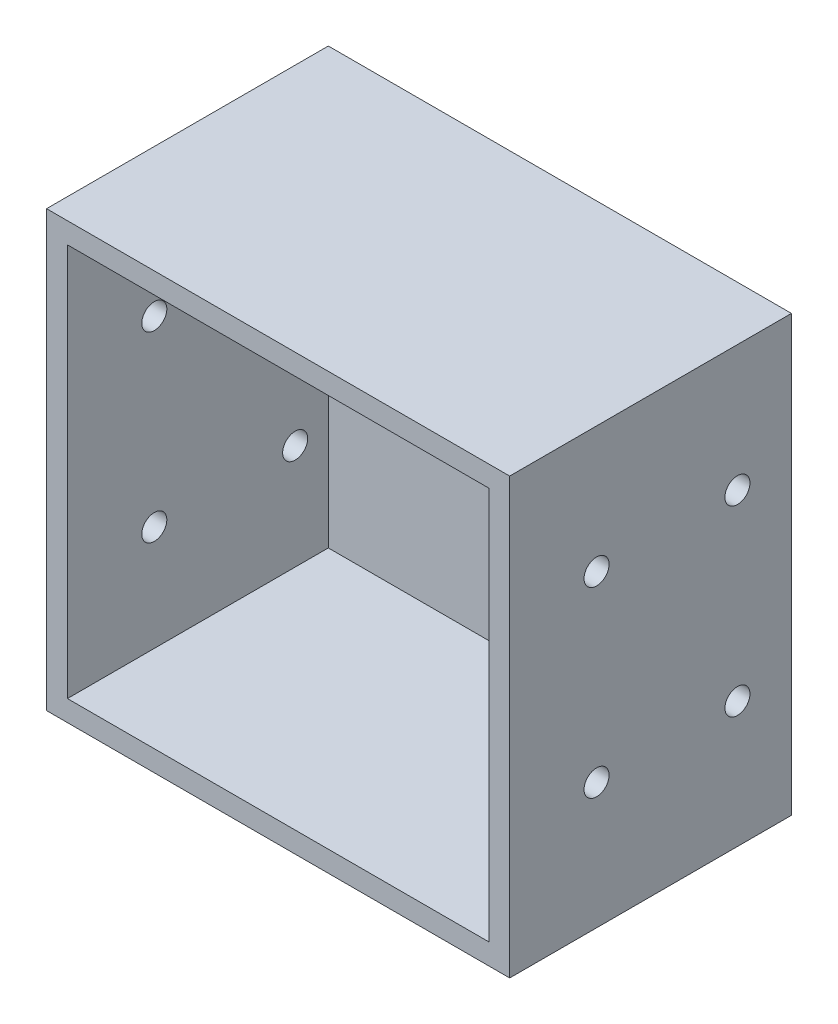
ISO-10303-21;
HEADER;
FILE_DESCRIPTION(('STEP AP214'),'2;1');
FILE_NAME('part.step','',(''),(''),'','','');
FILE_SCHEMA(('AUTOMOTIVE_DESIGN { 1 0 10303 214 1 1 1 1 }'));
ENDSEC;
DATA;
#1=APPLICATION_CONTEXT('core data for automotive mechanical design processes');
#2=APPLICATION_PROTOCOL_DEFINITION('international standard','automotive_design',2000,#1);
#3=PRODUCT_CONTEXT('',#1,'mechanical');
#4=PRODUCT('Part','Part','',(#3));
#5=PRODUCT_RELATED_PRODUCT_CATEGORY('part','',(#4));
#6=PRODUCT_DEFINITION_FORMATION('','',#4);
#7=PRODUCT_DEFINITION_CONTEXT('part definition',#1,'design');
#8=PRODUCT_DEFINITION('design','',#6,#7);
#9=PRODUCT_DEFINITION_SHAPE('','',#8);
#10=(LENGTH_UNIT() NAMED_UNIT(*) SI_UNIT(.MILLI.,.METRE.));
#11=(NAMED_UNIT(*) PLANE_ANGLE_UNIT() SI_UNIT($,.RADIAN.));
#12=(NAMED_UNIT(*) SI_UNIT($,.STERADIAN.) SOLID_ANGLE_UNIT());
#13=UNCERTAINTY_MEASURE_WITH_UNIT(LENGTH_MEASURE(1.E-05),#10,'distance_accuracy_value','');
#14=(GEOMETRIC_REPRESENTATION_CONTEXT(3) GLOBAL_UNCERTAINTY_ASSIGNED_CONTEXT((#13)) GLOBAL_UNIT_ASSIGNED_CONTEXT((#10,
#11,#12)) REPRESENTATION_CONTEXT('',''));
#15=CARTESIAN_POINT('',(0.,0.,0.));
#16=DIRECTION('',(0.,0.,1.));
#17=DIRECTION('',(1.,0.,0.));
#18=AXIS2_PLACEMENT_3D('',#15,#16,#17);
#19=CARTESIAN_POINT('',(44.381,37.656,50.));
#20=DIRECTION('',(-1.,0.,0.));
#21=DIRECTION('',(0.,-1.,0.));
#22=AXIS2_PLACEMENT_3D('',#19,#20,#21);
#23=PLANE('',#22);
#24=CARTESIAN_POINT('',(44.381,-17.5,33.35));
#25=DIRECTION('',(1.,0.,0.));
#26=DIRECTION('',(0.,0.,-1.));
#27=AXIS2_PLACEMENT_3D('',#24,#25,#26);
#28=CIRCLE('',#27,2.39999999999999);
#29=CARTESIAN_POINT('',(44.381,-17.5,30.95));
#30=VERTEX_POINT('',#29);
#31=EDGE_CURVE('E309',#30,#30,#28,.T.);
#32=ORIENTED_EDGE('',*,*,#31,.F.);
#33=EDGE_LOOP('',(#32));
#34=FACE_BOUND('',#33,.T.);
#35=CARTESIAN_POINT('',(44.381,-17.5000000000005,6.35000000000013));
#36=DIRECTION('',(1.,0.,0.));
#37=DIRECTION('',(0.,0.,-1.));
#38=AXIS2_PLACEMENT_3D('',#35,#36,#37);
#39=CIRCLE('',#38,2.39999999999999);
#40=CARTESIAN_POINT('',(44.381,-17.5000000000005,3.95000000000014));
#41=VERTEX_POINT('',#40);
#42=EDGE_CURVE('E300',#41,#41,#39,.T.);
#43=ORIENTED_EDGE('',*,*,#42,.F.);
#44=EDGE_LOOP('',(#43));
#45=FACE_BOUND('',#44,.T.);
#46=CARTESIAN_POINT('',(44.381,17.4999999999995,6.34999999999989));
#47=DIRECTION('',(1.,0.,0.));
#48=DIRECTION('',(0.,0.,-1.));
#49=AXIS2_PLACEMENT_3D('',#46,#47,#48);
#50=CIRCLE('',#49,2.39999999999999);
#51=CARTESIAN_POINT('',(44.381,17.4999999999995,3.9499999999999));
#52=VERTEX_POINT('',#51);
#53=EDGE_CURVE('E177',#52,#52,#50,.T.);
#54=ORIENTED_EDGE('',*,*,#53,.F.);
#55=EDGE_LOOP('',(#54));
#56=FACE_BOUND('',#55,.T.);
#57=DIRECTION('',(0.,1.,0.));
#58=VECTOR('',#57,1.);
#59=CARTESIAN_POINT('',(44.381,37.656,-4.));
#60=LINE('',#59,#58);
#61=CARTESIAN_POINT('',(44.381,-41.656,-4.));
#62=VERTEX_POINT('',#61);
#63=CARTESIAN_POINT('',(44.381,41.656,-4.));
#64=VERTEX_POINT('',#63);
#65=EDGE_CURVE('E156',#62,#64,#60,.T.);
#66=ORIENTED_EDGE('',*,*,#65,.T.);
#67=DIRECTION('',(0.,0.,-1.));
#68=VECTOR('',#67,1.);
#69=CARTESIAN_POINT('',(44.381,41.656,50.));
#70=LINE('',#69,#68);
#71=CARTESIAN_POINT('',(44.381,41.656,50.));
#72=VERTEX_POINT('',#71);
#73=EDGE_CURVE('E154',#72,#64,#70,.T.);
#74=ORIENTED_EDGE('',*,*,#73,.F.);
#75=DIRECTION('',(0.,1.,0.));
#76=VECTOR('',#75,1.);
#77=CARTESIAN_POINT('',(44.381,37.656,50.));
#78=LINE('',#77,#76);
#79=CARTESIAN_POINT('',(44.381,-41.656,50.));
#80=VERTEX_POINT('',#79);
#81=EDGE_CURVE('E168',#80,#72,#78,.T.);
#82=ORIENTED_EDGE('',*,*,#81,.F.);
#83=DIRECTION('',(0.,0.,-1.));
#84=VECTOR('',#83,1.);
#85=CARTESIAN_POINT('',(44.381,-41.656,50.));
#86=LINE('',#85,#84);
#87=EDGE_CURVE('E46',#80,#62,#86,.T.);
#88=ORIENTED_EDGE('',*,*,#87,.T.);
#89=EDGE_LOOP('',(#66,#74,#82,#88));
#90=FACE_BOUND('',#89,.T.);
#91=CARTESIAN_POINT('',(44.381,17.5,33.3499999999995));
#92=DIRECTION('',(1.,0.,0.));
#93=DIRECTION('',(0.,0.,-1.));
#94=AXIS2_PLACEMENT_3D('',#91,#92,#93);
#95=CIRCLE('',#94,2.39999999999999);
#96=CARTESIAN_POINT('',(44.381,17.5,30.9499999999995));
#97=VERTEX_POINT('',#96);
#98=EDGE_CURVE('E180',#97,#97,#95,.T.);
#99=ORIENTED_EDGE('',*,*,#98,.F.);
#100=EDGE_LOOP('',(#99));
#101=FACE_BOUND('',#100,.T.);
#102=ADVANCED_FACE('F37',(#34,#45,#56,#90,#101),#23,.F.);
#103=CARTESIAN_POINT('',(-44.381,37.656,50.));
#104=DIRECTION('',(1.,0.,0.));
#105=DIRECTION('',(0.,1.,0.));
#106=AXIS2_PLACEMENT_3D('',#103,#104,#105);
#107=PLANE('',#106);
#108=CARTESIAN_POINT('',(-44.381,-17.5,33.35));
#109=DIRECTION('',(1.,0.,0.));
#110=DIRECTION('',(0.,0.,-1.));
#111=AXIS2_PLACEMENT_3D('',#108,#109,#110);
#112=CIRCLE('',#111,2.39999999999998);
#113=CARTESIAN_POINT('',(-44.381,-17.5,30.95));
#114=VERTEX_POINT('',#113);
#115=EDGE_CURVE('E306',#114,#114,#112,.T.);
#116=ORIENTED_EDGE('',*,*,#115,.T.);
#117=EDGE_LOOP('',(#116));
#118=FACE_BOUND('',#117,.T.);
#119=CARTESIAN_POINT('',(-44.381,-17.5000000000005,6.35000000000013));
#120=DIRECTION('',(1.,0.,0.));
#121=DIRECTION('',(0.,0.,-1.));
#122=AXIS2_PLACEMENT_3D('',#119,#120,#121);
#123=CIRCLE('',#122,2.39999999999998);
#124=CARTESIAN_POINT('',(-44.381,-17.5000000000005,3.95000000000015));
#125=VERTEX_POINT('',#124);
#126=EDGE_CURVE('E295',#125,#125,#123,.T.);
#127=ORIENTED_EDGE('',*,*,#126,.T.);
#128=EDGE_LOOP('',(#127));
#129=FACE_BOUND('',#128,.T.);
#130=CARTESIAN_POINT('',(-44.381,17.5,33.3499999999995));
#131=DIRECTION('',(1.,0.,0.));
#132=DIRECTION('',(0.,0.,-1.));
#133=AXIS2_PLACEMENT_3D('',#130,#131,#132);
#134=CIRCLE('',#133,2.39999999999998);
#135=CARTESIAN_POINT('',(-44.381,17.5,30.9499999999995));
#136=VERTEX_POINT('',#135);
#137=EDGE_CURVE('E173',#136,#136,#134,.T.);
#138=ORIENTED_EDGE('',*,*,#137,.T.);
#139=EDGE_LOOP('',(#138));
#140=FACE_BOUND('',#139,.T.);
#141=CARTESIAN_POINT('',(-44.381,17.4999999999995,6.34999999999989));
#142=DIRECTION('',(1.,0.,0.));
#143=DIRECTION('',(0.,0.,-1.));
#144=AXIS2_PLACEMENT_3D('',#141,#142,#143);
#145=CIRCLE('',#144,2.39999999999998);
#146=CARTESIAN_POINT('',(-44.381,17.4999999999995,3.94999999999991));
#147=VERTEX_POINT('',#146);
#148=EDGE_CURVE('E191',#147,#147,#145,.T.);
#149=ORIENTED_EDGE('',*,*,#148,.T.);
#150=EDGE_LOOP('',(#149));
#151=FACE_BOUND('',#150,.T.);
#152=DIRECTION('',(0.,-1.,0.));
#153=VECTOR('',#152,1.);
#154=CARTESIAN_POINT('',(-44.381,37.656,-4.));
#155=LINE('',#154,#153);
#156=CARTESIAN_POINT('',(-44.381,41.656,-4.));
#157=VERTEX_POINT('',#156);
#158=CARTESIAN_POINT('',(-44.381,-41.656,-4.));
#159=VERTEX_POINT('',#158);
#160=EDGE_CURVE('E126',#157,#159,#155,.T.);
#161=ORIENTED_EDGE('',*,*,#160,.T.);
#162=DIRECTION('',(0.,0.,-1.));
#163=VECTOR('',#162,1.);
#164=CARTESIAN_POINT('',(-44.381,-41.656,50.));
#165=LINE('',#164,#163);
#166=CARTESIAN_POINT('',(-44.381,-41.656,50.));
#167=VERTEX_POINT('',#166);
#168=EDGE_CURVE('E11',#167,#159,#165,.T.);
#169=ORIENTED_EDGE('',*,*,#168,.F.);
#170=DIRECTION('',(0.,-1.,0.));
#171=VECTOR('',#170,1.);
#172=CARTESIAN_POINT('',(-44.381,37.656,50.));
#173=LINE('',#172,#171);
#174=CARTESIAN_POINT('',(-44.381,41.656,50.));
#175=VERTEX_POINT('',#174);
#176=EDGE_CURVE('E164',#175,#167,#173,.T.);
#177=ORIENTED_EDGE('',*,*,#176,.F.);
#178=DIRECTION('',(0.,0.,-1.));
#179=VECTOR('',#178,1.);
#180=CARTESIAN_POINT('',(-44.381,41.656,50.));
#181=LINE('',#180,#179);
#182=EDGE_CURVE('E151',#175,#157,#181,.T.);
#183=ORIENTED_EDGE('',*,*,#182,.T.);
#184=EDGE_LOOP('',(#161,#169,#177,#183));
#185=FACE_BOUND('',#184,.T.);
#186=ADVANCED_FACE('F218',(#118,#129,#140,#151,#185),#107,.F.);
#187=CARTESIAN_POINT('',(-40.381,-41.656,50.));
#188=DIRECTION('',(0.,1.,0.));
#189=DIRECTION('',(0.,0.,1.));
#190=AXIS2_PLACEMENT_3D('',#187,#188,#189);
#191=PLANE('',#190);
#192=DIRECTION('',(1.,0.,0.));
#193=VECTOR('',#192,1.);
#194=CARTESIAN_POINT('',(-40.381,-41.656,-4.));
#195=LINE('',#194,#193);
#196=EDGE_CURVE('E149',#159,#62,#195,.T.);
#197=ORIENTED_EDGE('',*,*,#196,.T.);
#198=ORIENTED_EDGE('',*,*,#87,.F.);
#199=DIRECTION('',(1.,0.,0.));
#200=VECTOR('',#199,1.);
#201=CARTESIAN_POINT('',(-40.381,-41.656,50.));
#202=LINE('',#201,#200);
#203=EDGE_CURVE('E166',#167,#80,#202,.T.);
#204=ORIENTED_EDGE('',*,*,#203,.F.);
#205=ORIENTED_EDGE('',*,*,#168,.T.);
#206=EDGE_LOOP('',(#197,#198,#204,#205));
#207=FACE_BOUND('',#206,.T.);
#208=ADVANCED_FACE('F224',(#207),#191,.F.);
#209=CARTESIAN_POINT('',(-40.381,41.656,50.));
#210=DIRECTION('',(0.,-1.,0.));
#211=DIRECTION('',(0.,0.,-1.));
#212=AXIS2_PLACEMENT_3D('',#209,#210,#211);
#213=PLANE('',#212);
#214=DIRECTION('',(-1.,0.,0.));
#215=VECTOR('',#214,1.);
#216=CARTESIAN_POINT('',(-40.381,41.656,-4.));
#217=LINE('',#216,#215);
#218=EDGE_CURVE('E160',#64,#157,#217,.T.);
#219=ORIENTED_EDGE('',*,*,#218,.T.);
#220=ORIENTED_EDGE('',*,*,#182,.F.);
#221=DIRECTION('',(-1.,0.,0.));
#222=VECTOR('',#221,1.);
#223=CARTESIAN_POINT('',(-40.381,41.656,50.));
#224=LINE('',#223,#222);
#225=EDGE_CURVE('E62',#72,#175,#224,.T.);
#226=ORIENTED_EDGE('',*,*,#225,.F.);
#227=ORIENTED_EDGE('',*,*,#73,.T.);
#228=EDGE_LOOP('',(#219,#220,#226,#227));
#229=FACE_BOUND('',#228,.T.);
#230=ADVANCED_FACE('F230',(#229),#213,.F.);
#231=CARTESIAN_POINT('',(0.,0.,50.));
#232=DIRECTION('',(0.,0.,1.));
#233=DIRECTION('',(1.,0.,0.));
#234=AXIS2_PLACEMENT_3D('',#231,#232,#233);
#235=PLANE('',#234);
#236=DIRECTION('',(0.,-1.,0.));
#237=VECTOR('',#236,1.);
#238=CARTESIAN_POINT('',(-40.381,37.656,50.));
#239=LINE('',#238,#237);
#240=CARTESIAN_POINT('',(-40.381,37.656,50.));
#241=VERTEX_POINT('',#240);
#242=CARTESIAN_POINT('',(-40.381,-37.656,50.));
#243=VERTEX_POINT('',#242);
#244=EDGE_CURVE('E107',#241,#243,#239,.T.);
#245=ORIENTED_EDGE('',*,*,#244,.F.);
#246=DIRECTION('',(-1.,0.,0.));
#247=VECTOR('',#246,1.);
#248=CARTESIAN_POINT('',(-40.381,37.656,50.));
#249=LINE('',#248,#247);
#250=CARTESIAN_POINT('',(40.381,37.656,50.));
#251=VERTEX_POINT('',#250);
#252=EDGE_CURVE('E133',#251,#241,#249,.T.);
#253=ORIENTED_EDGE('',*,*,#252,.F.);
#254=DIRECTION('',(0.,1.,0.));
#255=VECTOR('',#254,1.);
#256=CARTESIAN_POINT('',(40.381,37.656,50.));
#257=LINE('',#256,#255);
#258=CARTESIAN_POINT('',(40.381,-37.656,50.));
#259=VERTEX_POINT('',#258);
#260=EDGE_CURVE('E131',#259,#251,#257,.T.);
#261=ORIENTED_EDGE('',*,*,#260,.F.);
#262=DIRECTION('',(1.,0.,0.));
#263=VECTOR('',#262,1.);
#264=CARTESIAN_POINT('',(-40.381,-37.656,50.));
#265=LINE('',#264,#263);
#266=EDGE_CURVE('E118',#243,#259,#265,.T.);
#267=ORIENTED_EDGE('',*,*,#266,.F.);
#268=EDGE_LOOP('',(#245,#253,#261,#267));
#269=FACE_BOUND('',#268,.T.);
#270=ORIENTED_EDGE('',*,*,#176,.T.);
#271=ORIENTED_EDGE('',*,*,#203,.T.);
#272=ORIENTED_EDGE('',*,*,#81,.T.);
#273=ORIENTED_EDGE('',*,*,#225,.T.);
#274=EDGE_LOOP('',(#270,#271,#272,#273));
#275=FACE_BOUND('',#274,.T.);
#276=ADVANCED_FACE('F130',(#269,#275),#235,.T.);
#277=CARTESIAN_POINT('',(0.,0.,-4.));
#278=DIRECTION('',(0.,0.,1.));
#279=DIRECTION('',(1.,0.,0.));
#280=AXIS2_PLACEMENT_3D('',#277,#278,#279);
#281=PLANE('',#280);
#282=ORIENTED_EDGE('',*,*,#160,.F.);
#283=ORIENTED_EDGE('',*,*,#218,.F.);
#284=ORIENTED_EDGE('',*,*,#65,.F.);
#285=ORIENTED_EDGE('',*,*,#196,.F.);
#286=EDGE_LOOP('',(#282,#283,#284,#285));
#287=FACE_BOUND('',#286,.T.);
#288=ADVANCED_FACE('F39',(#287),#281,.F.);
#289=CARTESIAN_POINT('',(-40.381,37.656,50.));
#290=DIRECTION('',(1.,0.,0.));
#291=DIRECTION('',(0.,1.,0.));
#292=AXIS2_PLACEMENT_3D('',#289,#290,#291);
#293=PLANE('',#292);
#294=CARTESIAN_POINT('',(-40.381,-17.5,33.35));
#295=DIRECTION('',(1.,0.,0.));
#296=DIRECTION('',(0.,1.,0.));
#297=AXIS2_PLACEMENT_3D('',#294,#295,#296);
#298=CIRCLE('',#297,2.39999999999998);
#299=CARTESIAN_POINT('',(-40.381,-15.1,33.35));
#300=VERTEX_POINT('',#299);
#301=EDGE_CURVE('E41',#300,#300,#298,.T.);
#302=ORIENTED_EDGE('',*,*,#301,.F.);
#303=EDGE_LOOP('',(#302));
#304=FACE_BOUND('',#303,.T.);
#305=CARTESIAN_POINT('',(-40.381,-17.5000000000005,6.35000000000013));
#306=DIRECTION('',(1.,0.,0.));
#307=DIRECTION('',(0.,1.,0.));
#308=AXIS2_PLACEMENT_3D('',#305,#306,#307);
#309=CIRCLE('',#308,2.39999999999998);
#310=CARTESIAN_POINT('',(-40.381,-15.1000000000006,6.35000000000013));
#311=VERTEX_POINT('',#310);
#312=EDGE_CURVE('E185',#311,#311,#309,.T.);
#313=ORIENTED_EDGE('',*,*,#312,.F.);
#314=EDGE_LOOP('',(#313));
#315=FACE_BOUND('',#314,.T.);
#316=CARTESIAN_POINT('',(-40.381,17.5,33.3499999999995));
#317=DIRECTION('',(1.,0.,0.));
#318=DIRECTION('',(0.,1.,0.));
#319=AXIS2_PLACEMENT_3D('',#316,#317,#318);
#320=CIRCLE('',#319,2.39999999999998);
#321=CARTESIAN_POINT('',(-40.381,19.9,33.3499999999995));
#322=VERTEX_POINT('',#321);
#323=EDGE_CURVE('E170',#322,#322,#320,.T.);
#324=ORIENTED_EDGE('',*,*,#323,.F.);
#325=EDGE_LOOP('',(#324));
#326=FACE_BOUND('',#325,.T.);
#327=CARTESIAN_POINT('',(-40.381,17.4999999999995,6.34999999999989));
#328=DIRECTION('',(1.,0.,0.));
#329=DIRECTION('',(0.,1.,0.));
#330=AXIS2_PLACEMENT_3D('',#327,#328,#329);
#331=CIRCLE('',#330,2.39999999999998);
#332=CARTESIAN_POINT('',(-40.381,19.8999999999994,6.34999999999989));
#333=VERTEX_POINT('',#332);
#334=EDGE_CURVE('E194',#333,#333,#331,.T.);
#335=ORIENTED_EDGE('',*,*,#334,.F.);
#336=EDGE_LOOP('',(#335));
#337=FACE_BOUND('',#336,.T.);
#338=DIRECTION('',(0.,-1.,0.));
#339=VECTOR('',#338,1.);
#340=CARTESIAN_POINT('',(-40.381,37.656,0.));
#341=LINE('',#340,#339);
#342=CARTESIAN_POINT('',(-40.381,37.656,0.));
#343=VERTEX_POINT('',#342);
#344=CARTESIAN_POINT('',(-40.381,-37.656,0.));
#345=VERTEX_POINT('',#344);
#346=EDGE_CURVE('E138',#343,#345,#341,.T.);
#347=ORIENTED_EDGE('',*,*,#346,.F.);
#348=DIRECTION('',(0.,0.,-1.));
#349=VECTOR('',#348,1.);
#350=CARTESIAN_POINT('',(-40.381,37.656,50.));
#351=LINE('',#350,#349);
#352=EDGE_CURVE('E114',#241,#343,#351,.T.);
#353=ORIENTED_EDGE('',*,*,#352,.F.);
#354=ORIENTED_EDGE('',*,*,#244,.T.);
#355=DIRECTION('',(0.,0.,-1.));
#356=VECTOR('',#355,1.);
#357=CARTESIAN_POINT('',(-40.381,-37.656,50.));
#358=LINE('',#357,#356);
#359=EDGE_CURVE('E111',#243,#345,#358,.T.);
#360=ORIENTED_EDGE('',*,*,#359,.T.);
#361=EDGE_LOOP('',(#347,#353,#354,#360));
#362=FACE_BOUND('',#361,.T.);
#363=ADVANCED_FACE('F110',(#304,#315,#326,#337,#362),#293,.T.);
#364=CARTESIAN_POINT('',(-40.381,-37.656,50.));
#365=DIRECTION('',(0.,1.,0.));
#366=DIRECTION('',(0.,0.,1.));
#367=AXIS2_PLACEMENT_3D('',#364,#365,#366);
#368=PLANE('',#367);
#369=DIRECTION('',(1.,0.,0.));
#370=VECTOR('',#369,1.);
#371=CARTESIAN_POINT('',(-40.381,-37.656,0.));
#372=LINE('',#371,#370);
#373=CARTESIAN_POINT('',(40.381,-37.656,0.));
#374=VERTEX_POINT('',#373);
#375=EDGE_CURVE('E125',#345,#374,#372,.T.);
#376=ORIENTED_EDGE('',*,*,#375,.F.);
#377=ORIENTED_EDGE('',*,*,#359,.F.);
#378=ORIENTED_EDGE('',*,*,#266,.T.);
#379=DIRECTION('',(0.,0.,-1.));
#380=VECTOR('',#379,1.);
#381=CARTESIAN_POINT('',(40.381,-37.656,50.));
#382=LINE('',#381,#380);
#383=EDGE_CURVE('E127',#259,#374,#382,.T.);
#384=ORIENTED_EDGE('',*,*,#383,.T.);
#385=EDGE_LOOP('',(#376,#377,#378,#384));
#386=FACE_BOUND('',#385,.T.);
#387=ADVANCED_FACE('F122',(#386),#368,.T.);
#388=CARTESIAN_POINT('',(40.381,37.656,50.));
#389=DIRECTION('',(-1.,0.,0.));
#390=DIRECTION('',(0.,-1.,0.));
#391=AXIS2_PLACEMENT_3D('',#388,#389,#390);
#392=PLANE('',#391);
#393=CARTESIAN_POINT('',(40.381,-17.5,33.35));
#394=DIRECTION('',(-1.,0.,0.));
#395=DIRECTION('',(0.,-1.,0.));
#396=AXIS2_PLACEMENT_3D('',#393,#394,#395);
#397=CIRCLE('',#396,2.39999999999998);
#398=CARTESIAN_POINT('',(40.381,-19.9,33.35));
#399=VERTEX_POINT('',#398);
#400=EDGE_CURVE('E303',#399,#399,#397,.T.);
#401=ORIENTED_EDGE('',*,*,#400,.F.);
#402=EDGE_LOOP('',(#401));
#403=FACE_BOUND('',#402,.T.);
#404=CARTESIAN_POINT('',(40.381,-17.5000000000005,6.35000000000013));
#405=DIRECTION('',(-1.,0.,0.));
#406=DIRECTION('',(0.,-1.,0.));
#407=AXIS2_PLACEMENT_3D('',#404,#405,#406);
#408=CIRCLE('',#407,2.39999999999998);
#409=CARTESIAN_POINT('',(40.381,-19.9000000000005,6.35000000000013));
#410=VERTEX_POINT('',#409);
#411=EDGE_CURVE('E293',#410,#410,#408,.T.);
#412=ORIENTED_EDGE('',*,*,#411,.F.);
#413=EDGE_LOOP('',(#412));
#414=FACE_BOUND('',#413,.T.);
#415=CARTESIAN_POINT('',(40.381,17.5,33.3499999999995));
#416=DIRECTION('',(-1.,0.,0.));
#417=DIRECTION('',(0.,-1.,0.));
#418=AXIS2_PLACEMENT_3D('',#415,#416,#417);
#419=CIRCLE('',#418,2.39999999999998);
#420=CARTESIAN_POINT('',(40.381,15.1,33.3499999999995));
#421=VERTEX_POINT('',#420);
#422=EDGE_CURVE('E172',#421,#421,#419,.T.);
#423=ORIENTED_EDGE('',*,*,#422,.F.);
#424=EDGE_LOOP('',(#423));
#425=FACE_BOUND('',#424,.T.);
#426=CARTESIAN_POINT('',(40.381,17.4999999999995,6.34999999999989));
#427=DIRECTION('',(-1.,0.,0.));
#428=DIRECTION('',(0.,-1.,0.));
#429=AXIS2_PLACEMENT_3D('',#426,#427,#428);
#430=CIRCLE('',#429,2.39999999999998);
#431=CARTESIAN_POINT('',(40.381,15.0999999999995,6.34999999999989));
#432=VERTEX_POINT('',#431);
#433=EDGE_CURVE('E140',#432,#432,#430,.T.);
#434=ORIENTED_EDGE('',*,*,#433,.F.);
#435=EDGE_LOOP('',(#434));
#436=FACE_BOUND('',#435,.T.);
#437=DIRECTION('',(0.,1.,0.));
#438=VECTOR('',#437,1.);
#439=CARTESIAN_POINT('',(40.381,37.656,0.));
#440=LINE('',#439,#438);
#441=CARTESIAN_POINT('',(40.381,37.656,0.));
#442=VERTEX_POINT('',#441);
#443=EDGE_CURVE('E142',#374,#442,#440,.T.);
#444=ORIENTED_EDGE('',*,*,#443,.F.);
#445=ORIENTED_EDGE('',*,*,#383,.F.);
#446=ORIENTED_EDGE('',*,*,#260,.T.);
#447=DIRECTION('',(0.,0.,-1.));
#448=VECTOR('',#447,1.);
#449=CARTESIAN_POINT('',(40.381,37.656,50.));
#450=LINE('',#449,#448);
#451=EDGE_CURVE('E54',#251,#442,#450,.T.);
#452=ORIENTED_EDGE('',*,*,#451,.T.);
#453=EDGE_LOOP('',(#444,#445,#446,#452));
#454=FACE_BOUND('',#453,.T.);
#455=ADVANCED_FACE('F202',(#403,#414,#425,#436,#454),#392,.T.);
#456=CARTESIAN_POINT('',(-40.381,37.656,50.));
#457=DIRECTION('',(0.,-1.,0.));
#458=DIRECTION('',(0.,0.,-1.));
#459=AXIS2_PLACEMENT_3D('',#456,#457,#458);
#460=PLANE('',#459);
#461=DIRECTION('',(-1.,0.,0.));
#462=VECTOR('',#461,1.);
#463=CARTESIAN_POINT('',(-40.381,37.656,0.));
#464=LINE('',#463,#462);
#465=EDGE_CURVE('E119',#442,#343,#464,.T.);
#466=ORIENTED_EDGE('',*,*,#465,.F.);
#467=ORIENTED_EDGE('',*,*,#451,.F.);
#468=ORIENTED_EDGE('',*,*,#252,.T.);
#469=ORIENTED_EDGE('',*,*,#352,.T.);
#470=EDGE_LOOP('',(#466,#467,#468,#469));
#471=FACE_BOUND('',#470,.T.);
#472=ADVANCED_FACE('F205',(#471),#460,.T.);
#473=CARTESIAN_POINT('',(0.,0.,0.));
#474=DIRECTION('',(0.,0.,1.));
#475=DIRECTION('',(1.,0.,0.));
#476=AXIS2_PLACEMENT_3D('',#473,#474,#475);
#477=PLANE('',#476);
#478=ORIENTED_EDGE('',*,*,#346,.T.);
#479=ORIENTED_EDGE('',*,*,#375,.T.);
#480=ORIENTED_EDGE('',*,*,#443,.T.);
#481=ORIENTED_EDGE('',*,*,#465,.T.);
#482=EDGE_LOOP('',(#478,#479,#480,#481));
#483=FACE_BOUND('',#482,.T.);
#484=ADVANCED_FACE('F210',(#483),#477,.T.);
#485=CARTESIAN_POINT('',(44.381,17.4999999999995,6.34999999999989));
#486=DIRECTION('',(1.,0.,0.));
#487=DIRECTION('',(0.,0.,-1.));
#488=AXIS2_PLACEMENT_3D('',#485,#486,#487);
#489=CYLINDRICAL_SURFACE('',#488,2.39999999999998);
#490=ORIENTED_EDGE('',*,*,#433,.T.);
#491=EDGE_LOOP('',(#490));
#492=FACE_BOUND('',#491,.T.);
#493=ORIENTED_EDGE('',*,*,#53,.T.);
#494=EDGE_LOOP('',(#493));
#495=FACE_BOUND('',#494,.T.);
#496=ADVANCED_FACE('F199',(#492,#495),#489,.F.);
#497=ORIENTED_EDGE('',*,*,#334,.T.);
#498=EDGE_LOOP('',(#497));
#499=FACE_BOUND('',#498,.T.);
#500=ORIENTED_EDGE('',*,*,#148,.F.);
#501=EDGE_LOOP('',(#500));
#502=FACE_BOUND('',#501,.T.);
#503=ADVANCED_FACE('F266',(#499,#502),#489,.F.);
#504=CARTESIAN_POINT('',(44.381,17.5,33.3499999999995));
#505=DIRECTION('',(1.,0.,0.));
#506=DIRECTION('',(0.,0.,-1.));
#507=AXIS2_PLACEMENT_3D('',#504,#505,#506);
#508=CYLINDRICAL_SURFACE('',#507,2.39999999999998);
#509=ORIENTED_EDGE('',*,*,#323,.T.);
#510=EDGE_LOOP('',(#509));
#511=FACE_BOUND('',#510,.T.);
#512=ORIENTED_EDGE('',*,*,#137,.F.);
#513=EDGE_LOOP('',(#512));
#514=FACE_BOUND('',#513,.T.);
#515=ADVANCED_FACE('F256',(#511,#514),#508,.F.);
#516=ORIENTED_EDGE('',*,*,#422,.T.);
#517=EDGE_LOOP('',(#516));
#518=FACE_BOUND('',#517,.T.);
#519=ORIENTED_EDGE('',*,*,#98,.T.);
#520=EDGE_LOOP('',(#519));
#521=FACE_BOUND('',#520,.T.);
#522=ADVANCED_FACE('F253',(#518,#521),#508,.F.);
#523=CARTESIAN_POINT('',(44.381,-17.5000000000005,6.35000000000013));
#524=DIRECTION('',(1.,0.,0.));
#525=DIRECTION('',(0.,0.,-1.));
#526=AXIS2_PLACEMENT_3D('',#523,#524,#525);
#527=CYLINDRICAL_SURFACE('',#526,2.39999999999998);
#528=ORIENTED_EDGE('',*,*,#312,.T.);
#529=EDGE_LOOP('',(#528));
#530=FACE_BOUND('',#529,.T.);
#531=ORIENTED_EDGE('',*,*,#126,.F.);
#532=EDGE_LOOP('',(#531));
#533=FACE_BOUND('',#532,.T.);
#534=ADVANCED_FACE('F255',(#530,#533),#527,.F.);
#535=ORIENTED_EDGE('',*,*,#411,.T.);
#536=EDGE_LOOP('',(#535));
#537=FACE_BOUND('',#536,.T.);
#538=ORIENTED_EDGE('',*,*,#42,.T.);
#539=EDGE_LOOP('',(#538));
#540=FACE_BOUND('',#539,.T.);
#541=ADVANCED_FACE('F263',(#537,#540),#527,.F.);
#542=CARTESIAN_POINT('',(44.381,-17.5,33.35));
#543=DIRECTION('',(1.,0.,0.));
#544=DIRECTION('',(0.,0.,-1.));
#545=AXIS2_PLACEMENT_3D('',#542,#543,#544);
#546=CYLINDRICAL_SURFACE('',#545,2.39999999999998);
#547=ORIENTED_EDGE('',*,*,#301,.T.);
#548=EDGE_LOOP('',(#547));
#549=FACE_BOUND('',#548,.T.);
#550=ORIENTED_EDGE('',*,*,#115,.F.);
#551=EDGE_LOOP('',(#550));
#552=FACE_BOUND('',#551,.T.);
#553=ADVANCED_FACE('F314',(#549,#552),#546,.F.);
#554=ORIENTED_EDGE('',*,*,#400,.T.);
#555=EDGE_LOOP('',(#554));
#556=FACE_BOUND('',#555,.T.);
#557=ORIENTED_EDGE('',*,*,#31,.T.);
#558=EDGE_LOOP('',(#557));
#559=FACE_BOUND('',#558,.T.);
#560=ADVANCED_FACE('F312',(#556,#559),#546,.F.);
#561=CLOSED_SHELL('',(#102,#186,#208,#230,#276,#288,#363,#387,#455,#472,#484,#496,#503,#515,
#522,#534,#541,#553,#560));
#562=MANIFOLD_SOLID_BREP('B2',#561);
#563=ADVANCED_BREP_SHAPE_REPRESENTATION('',(#18,#562),#14);
#564=SHAPE_DEFINITION_REPRESENTATION(#9,#563);
ENDSEC;
END-ISO-10303-21;
